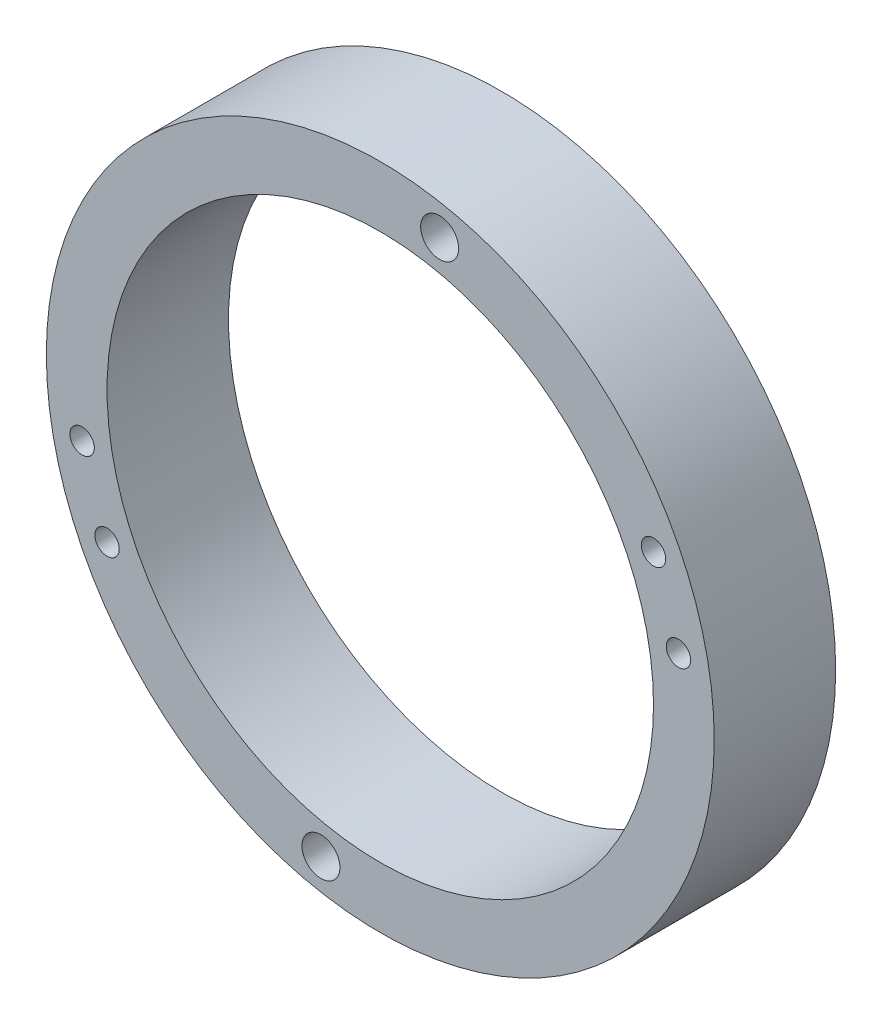
ISO-10303-21;
HEADER;
FILE_DESCRIPTION(('STEP AP214'),'2;1');
FILE_NAME('part.step','',(''),(''),'','','');
FILE_SCHEMA(('AUTOMOTIVE_DESIGN { 1 0 10303 214 1 1 1 1 }'));
ENDSEC;
DATA;
#1=APPLICATION_CONTEXT('core data for automotive mechanical design processes');
#2=APPLICATION_PROTOCOL_DEFINITION('international standard','automotive_design',2000,#1);
#3=PRODUCT_CONTEXT('',#1,'mechanical');
#4=PRODUCT('Part','Part','',(#3));
#5=PRODUCT_RELATED_PRODUCT_CATEGORY('part','',(#4));
#6=PRODUCT_DEFINITION_FORMATION('','',#4);
#7=PRODUCT_DEFINITION_CONTEXT('part definition',#1,'design');
#8=PRODUCT_DEFINITION('design','',#6,#7);
#9=PRODUCT_DEFINITION_SHAPE('','',#8);
#10=(LENGTH_UNIT() NAMED_UNIT(*) SI_UNIT(.MILLI.,.METRE.));
#11=(NAMED_UNIT(*) PLANE_ANGLE_UNIT() SI_UNIT($,.RADIAN.));
#12=(NAMED_UNIT(*) SI_UNIT($,.STERADIAN.) SOLID_ANGLE_UNIT());
#13=UNCERTAINTY_MEASURE_WITH_UNIT(LENGTH_MEASURE(1.E-05),#10,'distance_accuracy_value','');
#14=(GEOMETRIC_REPRESENTATION_CONTEXT(3) GLOBAL_UNCERTAINTY_ASSIGNED_CONTEXT((#13)) GLOBAL_UNIT_ASSIGNED_CONTEXT((#10,
#11,#12)) REPRESENTATION_CONTEXT('',''));
#15=CARTESIAN_POINT('',(0.,0.,0.));
#16=DIRECTION('',(0.,0.,1.));
#17=DIRECTION('',(1.,0.,0.));
#18=AXIS2_PLACEMENT_3D('',#15,#16,#17);
#19=CARTESIAN_POINT('',(0.,0.,12.7));
#20=DIRECTION('',(0.,0.,1.));
#21=DIRECTION('',(1.,0.,0.));
#22=AXIS2_PLACEMENT_3D('',#19,#20,#21);
#23=PLANE('',#22);
#24=CARTESIAN_POINT('',(12.4134359389585,62.2748473156649,12.7));
#25=DIRECTION('',(0.,0.,1.));
#26=DIRECTION('',(1.,0.,0.));
#27=AXIS2_PLACEMENT_3D('',#24,#25,#26);
#28=CIRCLE('',#27,3.96875);
#29=CARTESIAN_POINT('',(16.3821859389585,62.2748473156649,12.7));
#30=VERTEX_POINT('',#29);
#31=EDGE_CURVE('E111',#30,#30,#28,.T.);
#32=ORIENTED_EDGE('',*,*,#31,.F.);
#33=EDGE_LOOP('',(#32));
#34=FACE_BOUND('',#33,.T.);
#35=CARTESIAN_POINT('',(62.3665154678067,11.9443605272038,12.7));
#36=DIRECTION('',(0.,0.,1.));
#37=DIRECTION('',(1.,0.,0.));
#38=AXIS2_PLACEMENT_3D('',#35,#36,#37);
#39=CIRCLE('',#38,2.55269999999999);
#40=CARTESIAN_POINT('',(64.9192154678067,11.9443605272038,12.7));
#41=VERTEX_POINT('',#40);
#42=EDGE_CURVE('E103',#41,#41,#39,.T.);
#43=ORIENTED_EDGE('',*,*,#42,.F.);
#44=EDGE_LOOP('',(#43));
#45=FACE_BOUND('',#44,.T.);
#46=CARTESIAN_POINT('',(57.15,27.6790082914833,12.7));
#47=DIRECTION('',(0.,0.,1.));
#48=DIRECTION('',(1.,0.,0.));
#49=AXIS2_PLACEMENT_3D('',#46,#47,#48);
#50=CIRCLE('',#49,2.55269999999999);
#51=CARTESIAN_POINT('',(59.7027,27.6790082914833,12.7));
#52=VERTEX_POINT('',#51);
#53=EDGE_CURVE('E95',#52,#52,#50,.T.);
#54=ORIENTED_EDGE('',*,*,#53,.F.);
#55=EDGE_LOOP('',(#54));
#56=FACE_BOUND('',#55,.T.);
#57=CARTESIAN_POINT('',(-12.4134359389585,-62.2748473156649,12.7));
#58=DIRECTION('',(0.,0.,1.));
#59=DIRECTION('',(1.,0.,0.));
#60=AXIS2_PLACEMENT_3D('',#57,#58,#59);
#61=CIRCLE('',#60,3.96875);
#62=CARTESIAN_POINT('',(-8.44468593895851,-62.2748473156649,12.7));
#63=VERTEX_POINT('',#62);
#64=EDGE_CURVE('E87',#63,#63,#61,.T.);
#65=ORIENTED_EDGE('',*,*,#64,.F.);
#66=EDGE_LOOP('',(#65));
#67=FACE_BOUND('',#66,.T.);
#68=CARTESIAN_POINT('',(-62.3665154678067,-11.9443605272038,12.7));
#69=DIRECTION('',(0.,0.,1.));
#70=DIRECTION('',(1.,0.,0.));
#71=AXIS2_PLACEMENT_3D('',#68,#69,#70);
#72=CIRCLE('',#71,2.55269999999999);
#73=CARTESIAN_POINT('',(-59.8138154678067,-11.9443605272038,12.7));
#74=VERTEX_POINT('',#73);
#75=EDGE_CURVE('E79',#74,#74,#72,.T.);
#76=ORIENTED_EDGE('',*,*,#75,.F.);
#77=EDGE_LOOP('',(#76));
#78=FACE_BOUND('',#77,.T.);
#79=CARTESIAN_POINT('',(-57.15,-27.6790082914833,12.7));
#80=DIRECTION('',(0.,0.,1.));
#81=DIRECTION('',(1.,0.,0.));
#82=AXIS2_PLACEMENT_3D('',#79,#80,#81);
#83=CIRCLE('',#82,2.55269999999999);
#84=CARTESIAN_POINT('',(-54.5973,-27.6790082914833,12.7));
#85=VERTEX_POINT('',#84);
#86=EDGE_CURVE('E71',#85,#85,#83,.T.);
#87=ORIENTED_EDGE('',*,*,#86,.F.);
#88=EDGE_LOOP('',(#87));
#89=FACE_BOUND('',#88,.T.);
#90=CARTESIAN_POINT('',(0.,0.,12.7));
#91=DIRECTION('',(0.,0.,1.));
#92=DIRECTION('',(1.,0.,0.));
#93=AXIS2_PLACEMENT_3D('',#90,#91,#92);
#94=CIRCLE('',#93,69.85);
#95=CARTESIAN_POINT('',(69.85,0.,12.7));
#96=VERTEX_POINT('',#95);
#97=EDGE_CURVE('E10',#96,#96,#94,.T.);
#98=ORIENTED_EDGE('',*,*,#97,.T.);
#99=EDGE_LOOP('',(#98));
#100=FACE_BOUND('',#99,.T.);
#101=CARTESIAN_POINT('',(0.,0.,12.7));
#102=DIRECTION('',(0.,0.,1.));
#103=DIRECTION('',(1.,0.,0.));
#104=AXIS2_PLACEMENT_3D('',#101,#102,#103);
#105=CIRCLE('',#104,57.15);
#106=CARTESIAN_POINT('',(57.15,0.,12.7));
#107=VERTEX_POINT('',#106);
#108=EDGE_CURVE('E51',#107,#107,#105,.T.);
#109=ORIENTED_EDGE('',*,*,#108,.F.);
#110=EDGE_LOOP('',(#109));
#111=FACE_BOUND('',#110,.T.);
#112=ADVANCED_FACE('F43',(#34,#45,#56,#67,#78,#89,#100,#111),#23,.T.);
#113=CARTESIAN_POINT('',(0.,0.,12.7));
#114=DIRECTION('',(0.,0.,-1.));
#115=DIRECTION('',(-1.,0.,0.));
#116=AXIS2_PLACEMENT_3D('',#113,#114,#115);
#117=CYLINDRICAL_SURFACE('',#116,69.85);
#118=ORIENTED_EDGE('',*,*,#97,.F.);
#119=EDGE_LOOP('',(#118));
#120=FACE_BOUND('',#119,.T.);
#121=CARTESIAN_POINT('',(0.,0.,-12.7));
#122=DIRECTION('',(0.,0.,1.));
#123=DIRECTION('',(1.,0.,0.));
#124=AXIS2_PLACEMENT_3D('',#121,#122,#123);
#125=CIRCLE('',#124,69.85);
#126=CARTESIAN_POINT('',(69.85,0.,-12.7));
#127=VERTEX_POINT('',#126);
#128=EDGE_CURVE('E56',#127,#127,#125,.T.);
#129=ORIENTED_EDGE('',*,*,#128,.T.);
#130=EDGE_LOOP('',(#129));
#131=FACE_BOUND('',#130,.T.);
#132=ADVANCED_FACE('F45',(#120,#131),#117,.T.);
#133=CARTESIAN_POINT('',(0.,0.,12.7));
#134=DIRECTION('',(0.,0.,-1.));
#135=DIRECTION('',(-1.,0.,0.));
#136=AXIS2_PLACEMENT_3D('',#133,#134,#135);
#137=CYLINDRICAL_SURFACE('',#136,57.15);
#138=ORIENTED_EDGE('',*,*,#108,.T.);
#139=EDGE_LOOP('',(#138));
#140=FACE_BOUND('',#139,.T.);
#141=CARTESIAN_POINT('',(0.,0.,-12.7));
#142=DIRECTION('',(0.,0.,1.));
#143=DIRECTION('',(1.,0.,0.));
#144=AXIS2_PLACEMENT_3D('',#141,#142,#143);
#145=CIRCLE('',#144,57.15);
#146=CARTESIAN_POINT('',(57.15,0.,-12.7));
#147=VERTEX_POINT('',#146);
#148=EDGE_CURVE('E61',#147,#147,#145,.T.);
#149=ORIENTED_EDGE('',*,*,#148,.F.);
#150=EDGE_LOOP('',(#149));
#151=FACE_BOUND('',#150,.T.);
#152=ADVANCED_FACE('F145',(#140,#151),#137,.F.);
#153=CARTESIAN_POINT('',(0.,0.,-12.7));
#154=DIRECTION('',(0.,0.,1.));
#155=DIRECTION('',(1.,0.,0.));
#156=AXIS2_PLACEMENT_3D('',#153,#154,#155);
#157=PLANE('',#156);
#158=CARTESIAN_POINT('',(12.4134359389585,62.2748473156649,-12.7));
#159=DIRECTION('',(0.,0.,1.));
#160=DIRECTION('',(1.,0.,0.));
#161=AXIS2_PLACEMENT_3D('',#158,#159,#160);
#162=CIRCLE('',#161,3.96874999999999);
#163=CARTESIAN_POINT('',(16.3821859389585,62.2748473156649,-12.7));
#164=VERTEX_POINT('',#163);
#165=EDGE_CURVE('E107',#164,#164,#162,.T.);
#166=ORIENTED_EDGE('',*,*,#165,.T.);
#167=EDGE_LOOP('',(#166));
#168=FACE_BOUND('',#167,.T.);
#169=CARTESIAN_POINT('',(62.3665154678067,11.9443605272038,-12.7));
#170=DIRECTION('',(0.,0.,1.));
#171=DIRECTION('',(1.,0.,0.));
#172=AXIS2_PLACEMENT_3D('',#169,#170,#171);
#173=CIRCLE('',#172,2.55269999999999);
#174=CARTESIAN_POINT('',(64.9192154678067,11.9443605272038,-12.7));
#175=VERTEX_POINT('',#174);
#176=EDGE_CURVE('E99',#175,#175,#173,.T.);
#177=ORIENTED_EDGE('',*,*,#176,.T.);
#178=EDGE_LOOP('',(#177));
#179=FACE_BOUND('',#178,.T.);
#180=CARTESIAN_POINT('',(57.15,27.6790082914833,-12.7));
#181=DIRECTION('',(0.,0.,1.));
#182=DIRECTION('',(1.,0.,0.));
#183=AXIS2_PLACEMENT_3D('',#180,#181,#182);
#184=CIRCLE('',#183,2.5527);
#185=CARTESIAN_POINT('',(59.7027,27.6790082914833,-12.7));
#186=VERTEX_POINT('',#185);
#187=EDGE_CURVE('E91',#186,#186,#184,.T.);
#188=ORIENTED_EDGE('',*,*,#187,.T.);
#189=EDGE_LOOP('',(#188));
#190=FACE_BOUND('',#189,.T.);
#191=CARTESIAN_POINT('',(-12.4134359389585,-62.2748473156649,-12.7));
#192=DIRECTION('',(0.,0.,1.));
#193=DIRECTION('',(1.,0.,0.));
#194=AXIS2_PLACEMENT_3D('',#191,#192,#193);
#195=CIRCLE('',#194,3.96874999999999);
#196=CARTESIAN_POINT('',(-8.44468593895851,-62.2748473156649,-12.7));
#197=VERTEX_POINT('',#196);
#198=EDGE_CURVE('E83',#197,#197,#195,.T.);
#199=ORIENTED_EDGE('',*,*,#198,.T.);
#200=EDGE_LOOP('',(#199));
#201=FACE_BOUND('',#200,.T.);
#202=CARTESIAN_POINT('',(-62.3665154678067,-11.9443605272038,-12.7));
#203=DIRECTION('',(0.,0.,1.));
#204=DIRECTION('',(1.,0.,0.));
#205=AXIS2_PLACEMENT_3D('',#202,#203,#204);
#206=CIRCLE('',#205,2.5527);
#207=CARTESIAN_POINT('',(-59.8138154678067,-11.9443605272038,-12.7));
#208=VERTEX_POINT('',#207);
#209=EDGE_CURVE('E75',#208,#208,#206,.T.);
#210=ORIENTED_EDGE('',*,*,#209,.T.);
#211=EDGE_LOOP('',(#210));
#212=FACE_BOUND('',#211,.T.);
#213=CARTESIAN_POINT('',(-57.15,-27.6790082914833,-12.7));
#214=DIRECTION('',(0.,0.,1.));
#215=DIRECTION('',(1.,0.,0.));
#216=AXIS2_PLACEMENT_3D('',#213,#214,#215);
#217=CIRCLE('',#216,2.5527);
#218=CARTESIAN_POINT('',(-54.5973,-27.6790082914833,-12.7));
#219=VERTEX_POINT('',#218);
#220=EDGE_CURVE('E67',#219,#219,#217,.T.);
#221=ORIENTED_EDGE('',*,*,#220,.T.);
#222=EDGE_LOOP('',(#221));
#223=FACE_BOUND('',#222,.T.);
#224=ORIENTED_EDGE('',*,*,#148,.T.);
#225=EDGE_LOOP('',(#224));
#226=FACE_BOUND('',#225,.T.);
#227=ORIENTED_EDGE('',*,*,#128,.F.);
#228=EDGE_LOOP('',(#227));
#229=FACE_BOUND('',#228,.T.);
#230=ADVANCED_FACE('F134',(#168,#179,#190,#201,#212,#223,#226,#229),#157,.F.);
#231=CARTESIAN_POINT('',(-57.15,-27.6790082914833,12.7));
#232=DIRECTION('',(0.,0.,1.));
#233=DIRECTION('',(1.,0.,0.));
#234=AXIS2_PLACEMENT_3D('',#231,#232,#233);
#235=CYLINDRICAL_SURFACE('',#234,2.55269999999999);
#236=ORIENTED_EDGE('',*,*,#220,.F.);
#237=EDGE_LOOP('',(#236));
#238=FACE_BOUND('',#237,.T.);
#239=ORIENTED_EDGE('',*,*,#86,.T.);
#240=EDGE_LOOP('',(#239));
#241=FACE_BOUND('',#240,.T.);
#242=ADVANCED_FACE('F131',(#238,#241),#235,.F.);
#243=CARTESIAN_POINT('',(-62.3665154678067,-11.9443605272038,12.7));
#244=DIRECTION('',(0.,0.,1.));
#245=DIRECTION('',(1.,0.,0.));
#246=AXIS2_PLACEMENT_3D('',#243,#244,#245);
#247=CYLINDRICAL_SURFACE('',#246,2.55269999999999);
#248=ORIENTED_EDGE('',*,*,#209,.F.);
#249=EDGE_LOOP('',(#248));
#250=FACE_BOUND('',#249,.T.);
#251=ORIENTED_EDGE('',*,*,#75,.T.);
#252=EDGE_LOOP('',(#251));
#253=FACE_BOUND('',#252,.T.);
#254=ADVANCED_FACE('F133',(#250,#253),#247,.F.);
#255=CARTESIAN_POINT('',(-12.4134359389585,-62.2748473156649,12.7));
#256=DIRECTION('',(0.,0.,1.));
#257=DIRECTION('',(1.,0.,0.));
#258=AXIS2_PLACEMENT_3D('',#255,#256,#257);
#259=CYLINDRICAL_SURFACE('',#258,3.96874999999999);
#260=ORIENTED_EDGE('',*,*,#198,.F.);
#261=EDGE_LOOP('',(#260));
#262=FACE_BOUND('',#261,.T.);
#263=ORIENTED_EDGE('',*,*,#64,.T.);
#264=EDGE_LOOP('',(#263));
#265=FACE_BOUND('',#264,.T.);
#266=ADVANCED_FACE('F141',(#262,#265),#259,.F.);
#267=CARTESIAN_POINT('',(57.15,27.6790082914833,12.7));
#268=DIRECTION('',(0.,0.,1.));
#269=DIRECTION('',(1.,0.,0.));
#270=AXIS2_PLACEMENT_3D('',#267,#268,#269);
#271=CYLINDRICAL_SURFACE('',#270,2.55269999999999);
#272=ORIENTED_EDGE('',*,*,#187,.F.);
#273=EDGE_LOOP('',(#272));
#274=FACE_BOUND('',#273,.T.);
#275=ORIENTED_EDGE('',*,*,#53,.T.);
#276=EDGE_LOOP('',(#275));
#277=FACE_BOUND('',#276,.T.);
#278=ADVANCED_FACE('F198',(#274,#277),#271,.F.);
#279=CARTESIAN_POINT('',(62.3665154678067,11.9443605272038,12.7));
#280=DIRECTION('',(0.,0.,1.));
#281=DIRECTION('',(1.,0.,0.));
#282=AXIS2_PLACEMENT_3D('',#279,#280,#281);
#283=CYLINDRICAL_SURFACE('',#282,2.55269999999999);
#284=ORIENTED_EDGE('',*,*,#176,.F.);
#285=EDGE_LOOP('',(#284));
#286=FACE_BOUND('',#285,.T.);
#287=ORIENTED_EDGE('',*,*,#42,.T.);
#288=EDGE_LOOP('',(#287));
#289=FACE_BOUND('',#288,.T.);
#290=ADVANCED_FACE('F206',(#286,#289),#283,.F.);
#291=CARTESIAN_POINT('',(12.4134359389585,62.2748473156649,12.7));
#292=DIRECTION('',(0.,0.,1.));
#293=DIRECTION('',(1.,0.,0.));
#294=AXIS2_PLACEMENT_3D('',#291,#292,#293);
#295=CYLINDRICAL_SURFACE('',#294,3.96874999999999);
#296=ORIENTED_EDGE('',*,*,#165,.F.);
#297=EDGE_LOOP('',(#296));
#298=FACE_BOUND('',#297,.T.);
#299=ORIENTED_EDGE('',*,*,#31,.T.);
#300=EDGE_LOOP('',(#299));
#301=FACE_BOUND('',#300,.T.);
#302=ADVANCED_FACE('F116',(#298,#301),#295,.F.);
#303=CLOSED_SHELL('',(#112,#132,#152,#230,#242,#254,#266,#278,#290,#302));
#304=MANIFOLD_SOLID_BREP('B2',#303);
#305=ADVANCED_BREP_SHAPE_REPRESENTATION('',(#18,#304),#14);
#306=SHAPE_DEFINITION_REPRESENTATION(#9,#305);
ENDSEC;
END-ISO-10303-21;
